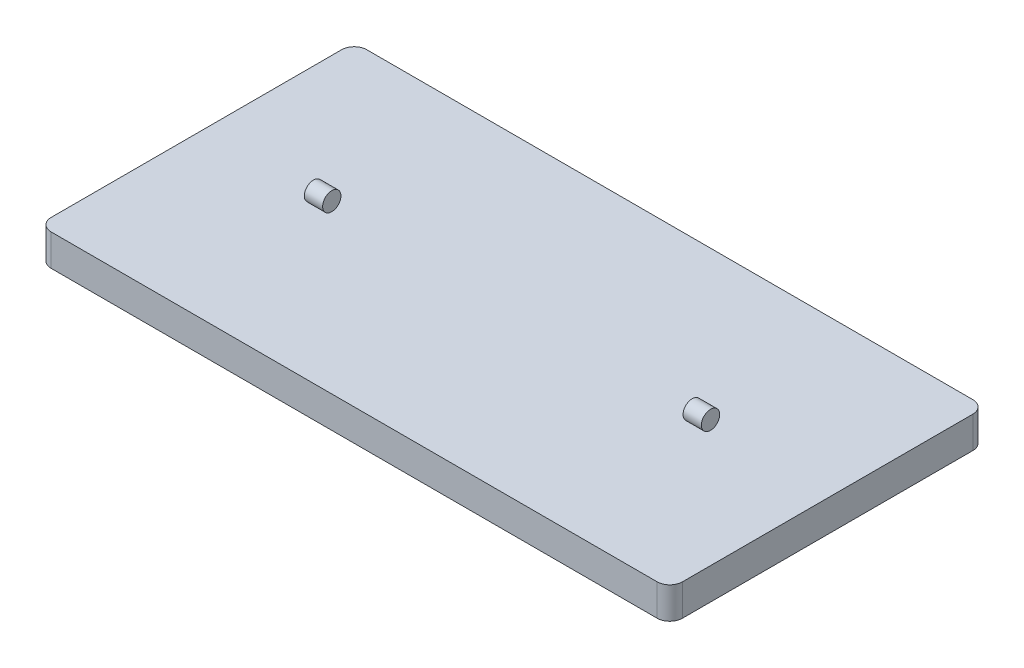
ISO-10303-21;
HEADER;
FILE_DESCRIPTION(('STEP AP214'),'2;1');
FILE_NAME('part.step','',(''),(''),'','','');
FILE_SCHEMA(('AUTOMOTIVE_DESIGN { 1 0 10303 214 1 1 1 1 }'));
ENDSEC;
DATA;
#1=APPLICATION_CONTEXT('core data for automotive mechanical design processes');
#2=APPLICATION_PROTOCOL_DEFINITION('international standard','automotive_design',2000,#1);
#3=PRODUCT_CONTEXT('',#1,'mechanical');
#4=PRODUCT('Part','Part','',(#3));
#5=PRODUCT_RELATED_PRODUCT_CATEGORY('part','',(#4));
#6=PRODUCT_DEFINITION_FORMATION('','',#4);
#7=PRODUCT_DEFINITION_CONTEXT('part definition',#1,'design');
#8=PRODUCT_DEFINITION('design','',#6,#7);
#9=PRODUCT_DEFINITION_SHAPE('','',#8);
#10=(LENGTH_UNIT() NAMED_UNIT(*) SI_UNIT(.MILLI.,.METRE.));
#11=(NAMED_UNIT(*) PLANE_ANGLE_UNIT() SI_UNIT($,.RADIAN.));
#12=(NAMED_UNIT(*) SI_UNIT($,.STERADIAN.) SOLID_ANGLE_UNIT());
#13=UNCERTAINTY_MEASURE_WITH_UNIT(LENGTH_MEASURE(1.E-05),#10,'distance_accuracy_value','');
#14=(GEOMETRIC_REPRESENTATION_CONTEXT(3) GLOBAL_UNCERTAINTY_ASSIGNED_CONTEXT((#13)) GLOBAL_UNIT_ASSIGNED_CONTEXT((#10,
#11,#12)) REPRESENTATION_CONTEXT('',''));
#15=CARTESIAN_POINT('',(0.,0.,0.));
#16=DIRECTION('',(0.,0.,1.));
#17=DIRECTION('',(1.,0.,0.));
#18=AXIS2_PLACEMENT_3D('',#15,#16,#17);
#19=CARTESIAN_POINT('',(-142.75,32.25,0.));
#20=DIRECTION('',(-1.,0.,0.));
#21=DIRECTION('',(0.,0.,-1.));
#22=AXIS2_PLACEMENT_3D('',#19,#20,#21);
#23=CYLINDRICAL_SURFACE('',#22,7.25);
#24=CARTESIAN_POINT('',(-142.75,32.25,0.));
#25=DIRECTION('',(1.,0.,0.));
#26=DIRECTION('',(0.,0.,-1.));
#27=AXIS2_PLACEMENT_3D('',#24,#25,#26);
#28=CIRCLE('',#27,7.25);
#29=CARTESIAN_POINT('',(-142.75,32.25,-7.25));
#30=VERTEX_POINT('',#29);
#31=EDGE_CURVE('E11',#30,#30,#28,.T.);
#32=CARTESIAN_POINT('',(-157.25,32.25,0.));
#33=DIRECTION('',(1.,0.,0.));
#34=DIRECTION('',(0.,0.,-1.));
#35=AXIS2_PLACEMENT_3D('',#32,#33,#34);
#36=CIRCLE('',#35,7.25);
#37=CARTESIAN_POINT('',(-157.25,32.25,-7.25));
#38=VERTEX_POINT('',#37);
#39=EDGE_CURVE('E56',#38,#38,#36,.T.);
#40=CARTESIAN_POINT('',(-142.75,32.25,-7.25));
#41=CARTESIAN_POINT('',(-142.901041666667,32.25,-7.25));
#42=CARTESIAN_POINT('',(-143.052083333333,32.25,-7.25));
#43=CARTESIAN_POINT('',(-143.354166666667,32.25,-7.25));
#44=CARTESIAN_POINT('',(-143.505208333333,32.25,-7.25));
#45=CARTESIAN_POINT('',(-143.807291666667,32.25,-7.25));
#46=CARTESIAN_POINT('',(-143.958333333333,32.25,-7.25));
#47=CARTESIAN_POINT('',(-144.260416666667,32.25,-7.25));
#48=CARTESIAN_POINT('',(-144.411458333333,32.25,-7.25));
#49=CARTESIAN_POINT('',(-144.713541666667,32.25,-7.25));
#50=CARTESIAN_POINT('',(-144.864583333333,32.25,-7.25));
#51=CARTESIAN_POINT('',(-145.166666666667,32.25,-7.25));
#52=CARTESIAN_POINT('',(-145.317708333333,32.25,-7.25));
#53=CARTESIAN_POINT('',(-145.619791666667,32.25,-7.25));
#54=CARTESIAN_POINT('',(-145.770833333333,32.25,-7.25));
#55=CARTESIAN_POINT('',(-146.072916666667,32.25,-7.25));
#56=CARTESIAN_POINT('',(-146.223958333333,32.25,-7.25));
#57=CARTESIAN_POINT('',(-146.526041666667,32.25,-7.25));
#58=CARTESIAN_POINT('',(-146.677083333333,32.25,-7.25));
#59=CARTESIAN_POINT('',(-146.979166666667,32.25,-7.25));
#60=CARTESIAN_POINT('',(-147.130208333333,32.25,-7.25));
#61=CARTESIAN_POINT('',(-147.432291666667,32.25,-7.25));
#62=CARTESIAN_POINT('',(-147.583333333333,32.25,-7.25));
#63=CARTESIAN_POINT('',(-147.885416666667,32.25,-7.25));
#64=CARTESIAN_POINT('',(-148.036458333333,32.25,-7.25));
#65=CARTESIAN_POINT('',(-148.338541666667,32.25,-7.25));
#66=CARTESIAN_POINT('',(-148.489583333333,32.25,-7.25));
#67=CARTESIAN_POINT('',(-148.791666666667,32.25,-7.25));
#68=CARTESIAN_POINT('',(-148.942708333333,32.25,-7.25));
#69=CARTESIAN_POINT('',(-149.244791666667,32.25,-7.25));
#70=CARTESIAN_POINT('',(-149.395833333333,32.25,-7.25));
#71=CARTESIAN_POINT('',(-149.697916666667,32.25,-7.25));
#72=CARTESIAN_POINT('',(-149.848958333333,32.25,-7.25));
#73=CARTESIAN_POINT('',(-150.151041666667,32.25,-7.25));
#74=CARTESIAN_POINT('',(-150.302083333333,32.25,-7.25));
#75=CARTESIAN_POINT('',(-150.604166666667,32.25,-7.25));
#76=CARTESIAN_POINT('',(-150.755208333333,32.25,-7.25));
#77=CARTESIAN_POINT('',(-151.057291666667,32.25,-7.25));
#78=CARTESIAN_POINT('',(-151.208333333333,32.25,-7.25));
#79=CARTESIAN_POINT('',(-151.510416666667,32.25,-7.25));
#80=CARTESIAN_POINT('',(-151.661458333333,32.25,-7.25));
#81=CARTESIAN_POINT('',(-151.963541666667,32.25,-7.25));
#82=CARTESIAN_POINT('',(-152.114583333333,32.25,-7.25));
#83=CARTESIAN_POINT('',(-152.416666666667,32.25,-7.25));
#84=CARTESIAN_POINT('',(-152.567708333333,32.25,-7.25));
#85=CARTESIAN_POINT('',(-152.869791666667,32.25,-7.25));
#86=CARTESIAN_POINT('',(-153.020833333333,32.25,-7.25));
#87=CARTESIAN_POINT('',(-153.322916666667,32.25,-7.25));
#88=CARTESIAN_POINT('',(-153.473958333333,32.25,-7.25));
#89=CARTESIAN_POINT('',(-153.776041666667,32.25,-7.25));
#90=CARTESIAN_POINT('',(-153.927083333333,32.25,-7.25));
#91=CARTESIAN_POINT('',(-154.229166666667,32.25,-7.25));
#92=CARTESIAN_POINT('',(-154.380208333333,32.25,-7.25));
#93=CARTESIAN_POINT('',(-154.682291666667,32.25,-7.25));
#94=CARTESIAN_POINT('',(-154.833333333333,32.25,-7.25));
#95=CARTESIAN_POINT('',(-155.135416666667,32.25,-7.25));
#96=CARTESIAN_POINT('',(-155.286458333333,32.25,-7.25));
#97=CARTESIAN_POINT('',(-155.588541666667,32.25,-7.25));
#98=CARTESIAN_POINT('',(-155.739583333333,32.25,-7.25));
#99=CARTESIAN_POINT('',(-156.041666666667,32.25,-7.25));
#100=CARTESIAN_POINT('',(-156.192708333333,32.25,-7.25));
#101=CARTESIAN_POINT('',(-156.494791666667,32.25,-7.25));
#102=CARTESIAN_POINT('',(-156.645833333333,32.25,-7.25));
#103=CARTESIAN_POINT('',(-156.947916666667,32.25,-7.25));
#104=CARTESIAN_POINT('',(-157.098958333333,32.25,-7.25));
#105=CARTESIAN_POINT('',(-157.25,32.25,-7.25));
#106=B_SPLINE_CURVE_WITH_KNOTS('',3,(#40,#41,#42,#43,#44,#45,#46,#47,#48,#49,#50,#51,#52,#53,
#54,#55,#56,#57,#58,#59,#60,#61,#62,#63,#64,#65,#66,#67,#68,#69,#70,#71,#72,#73,#74,#75,#76,#77,
#78,#79,#80,#81,#82,#83,#84,#85,#86,#87,#88,#89,#90,#91,#92,#93,#94,#95,#96,#97,#98,#99,#100,
#101,#102,#103,#104,#105),.UNSPECIFIED.,.F.,.F.,(4,2,2,2,2,2,2,2,2,2,2,2,2,2,2,2,2,2,2,2,2,2,2,
2,2,2,2,2,2,2,2,2,4),(0.,0.453124999999999,0.906249999999997,1.359375,1.81249999999999,
2.26562499999999,2.71874999999999,3.17187499999999,3.62499999999999,4.07812499999999,
4.53124999999999,4.98437499999999,5.43749999999998,5.89062499999998,6.34374999999998,
6.79687499999998,7.25000000000001,7.70312500000001,8.15625,8.609375,9.0625,9.515625,9.96875,
10.421875,10.875,11.328125,11.78125,12.234375,12.6875,13.140625,13.59375,14.046875,14.5),.UNSPECIFIED.);
#107=EDGE_CURVE('BSEAM50',#30,#38,#106,.T.);
#108=ORIENTED_EDGE('',*,*,#31,.F.);
#109=ORIENTED_EDGE('',*,*,#39,.T.);
#110=ORIENTED_EDGE('',*,*,#107,.T.);
#111=ORIENTED_EDGE('',*,*,#107,.F.);
#112=EDGE_LOOP('',(#108,#110,#109,#111));
#113=FACE_BOUND('',#112,.T.);
#114=ADVANCED_FACE('F50',(#113),#23,.T.);
#115=CARTESIAN_POINT('',(-142.75,32.25,0.));
#116=DIRECTION('',(-1.,0.,0.));
#117=DIRECTION('',(0.,0.,-1.));
#118=AXIS2_PLACEMENT_3D('',#115,#116,#117);
#119=PLANE('',#118);
#120=ORIENTED_EDGE('',*,*,#31,.T.);
#121=EDGE_LOOP('',(#120));
#122=FACE_BOUND('',#121,.T.);
#123=ADVANCED_FACE('F65',(#122),#119,.F.);
#124=CARTESIAN_POINT('',(-157.25,32.25,0.));
#125=DIRECTION('',(-1.,0.,0.));
#126=DIRECTION('',(0.,0.,-1.));
#127=AXIS2_PLACEMENT_3D('',#124,#125,#126);
#128=PLANE('',#127);
#129=ORIENTED_EDGE('',*,*,#39,.F.);
#130=EDGE_LOOP('',(#129));
#131=FACE_BOUND('',#130,.T.);
#132=ADVANCED_FACE('F63',(#131),#128,.T.);
#133=CLOSED_SHELL('',(#114,#123,#132));
#134=MANIFOLD_SOLID_BREP('B2',#133);
#135=CARTESIAN_POINT('',(142.75,32.25,0.));
#136=DIRECTION('',(1.,0.,0.));
#137=DIRECTION('',(0.,0.,-1.));
#138=AXIS2_PLACEMENT_3D('',#135,#136,#137);
#139=CYLINDRICAL_SURFACE('',#138,7.25);
#140=CARTESIAN_POINT('',(142.75,32.25,0.));
#141=DIRECTION('',(1.,0.,0.));
#142=DIRECTION('',(0.,0.,-1.));
#143=AXIS2_PLACEMENT_3D('',#140,#141,#142);
#144=CIRCLE('',#143,7.25);
#145=CARTESIAN_POINT('',(142.75,32.25,-7.25));
#146=VERTEX_POINT('',#145);
#147=EDGE_CURVE('E49',#146,#146,#144,.T.);
#148=CARTESIAN_POINT('',(157.25,32.25,0.));
#149=DIRECTION('',(1.,0.,0.));
#150=DIRECTION('',(0.,0.,-1.));
#151=AXIS2_PLACEMENT_3D('',#148,#149,#150);
#152=CIRCLE('',#151,7.25);
#153=CARTESIAN_POINT('',(157.25,32.25,-7.25));
#154=VERTEX_POINT('',#153);
#155=EDGE_CURVE('E112',#154,#154,#152,.T.);
#156=CARTESIAN_POINT('',(142.75,32.25,-7.25));
#157=CARTESIAN_POINT('',(142.901041666667,32.25,-7.25));
#158=CARTESIAN_POINT('',(143.052083333333,32.25,-7.25));
#159=CARTESIAN_POINT('',(143.354166666667,32.25,-7.25));
#160=CARTESIAN_POINT('',(143.505208333333,32.25,-7.25));
#161=CARTESIAN_POINT('',(143.807291666667,32.25,-7.25));
#162=CARTESIAN_POINT('',(143.958333333333,32.25,-7.25));
#163=CARTESIAN_POINT('',(144.260416666667,32.25,-7.25));
#164=CARTESIAN_POINT('',(144.411458333333,32.25,-7.25));
#165=CARTESIAN_POINT('',(144.713541666667,32.25,-7.25));
#166=CARTESIAN_POINT('',(144.864583333333,32.25,-7.25));
#167=CARTESIAN_POINT('',(145.166666666667,32.25,-7.25));
#168=CARTESIAN_POINT('',(145.317708333333,32.25,-7.25));
#169=CARTESIAN_POINT('',(145.619791666667,32.25,-7.25));
#170=CARTESIAN_POINT('',(145.770833333333,32.25,-7.25));
#171=CARTESIAN_POINT('',(146.072916666667,32.25,-7.25));
#172=CARTESIAN_POINT('',(146.223958333333,32.25,-7.25));
#173=CARTESIAN_POINT('',(146.526041666667,32.25,-7.25));
#174=CARTESIAN_POINT('',(146.677083333333,32.25,-7.25));
#175=CARTESIAN_POINT('',(146.979166666667,32.25,-7.25));
#176=CARTESIAN_POINT('',(147.130208333333,32.25,-7.25));
#177=CARTESIAN_POINT('',(147.432291666667,32.25,-7.25));
#178=CARTESIAN_POINT('',(147.583333333333,32.25,-7.25));
#179=CARTESIAN_POINT('',(147.885416666667,32.25,-7.25));
#180=CARTESIAN_POINT('',(148.036458333333,32.25,-7.25));
#181=CARTESIAN_POINT('',(148.338541666667,32.25,-7.25));
#182=CARTESIAN_POINT('',(148.489583333333,32.25,-7.25));
#183=CARTESIAN_POINT('',(148.791666666667,32.25,-7.25));
#184=CARTESIAN_POINT('',(148.942708333333,32.25,-7.25));
#185=CARTESIAN_POINT('',(149.244791666667,32.25,-7.25));
#186=CARTESIAN_POINT('',(149.395833333333,32.25,-7.25));
#187=CARTESIAN_POINT('',(149.697916666667,32.25,-7.25));
#188=CARTESIAN_POINT('',(149.848958333333,32.25,-7.25));
#189=CARTESIAN_POINT('',(150.151041666667,32.25,-7.25));
#190=CARTESIAN_POINT('',(150.302083333333,32.25,-7.25));
#191=CARTESIAN_POINT('',(150.604166666667,32.25,-7.25));
#192=CARTESIAN_POINT('',(150.755208333333,32.25,-7.25));
#193=CARTESIAN_POINT('',(151.057291666667,32.25,-7.25));
#194=CARTESIAN_POINT('',(151.208333333333,32.25,-7.25));
#195=CARTESIAN_POINT('',(151.510416666667,32.25,-7.25));
#196=CARTESIAN_POINT('',(151.661458333333,32.25,-7.25));
#197=CARTESIAN_POINT('',(151.963541666667,32.25,-7.25));
#198=CARTESIAN_POINT('',(152.114583333333,32.25,-7.25));
#199=CARTESIAN_POINT('',(152.416666666667,32.25,-7.25));
#200=CARTESIAN_POINT('',(152.567708333333,32.25,-7.25));
#201=CARTESIAN_POINT('',(152.869791666667,32.25,-7.25));
#202=CARTESIAN_POINT('',(153.020833333333,32.25,-7.25));
#203=CARTESIAN_POINT('',(153.322916666667,32.25,-7.25));
#204=CARTESIAN_POINT('',(153.473958333333,32.25,-7.25));
#205=CARTESIAN_POINT('',(153.776041666667,32.25,-7.25));
#206=CARTESIAN_POINT('',(153.927083333333,32.25,-7.25));
#207=CARTESIAN_POINT('',(154.229166666667,32.25,-7.25));
#208=CARTESIAN_POINT('',(154.380208333333,32.25,-7.25));
#209=CARTESIAN_POINT('',(154.682291666667,32.25,-7.25));
#210=CARTESIAN_POINT('',(154.833333333333,32.25,-7.25));
#211=CARTESIAN_POINT('',(155.135416666667,32.25,-7.25));
#212=CARTESIAN_POINT('',(155.286458333333,32.25,-7.25));
#213=CARTESIAN_POINT('',(155.588541666667,32.25,-7.25));
#214=CARTESIAN_POINT('',(155.739583333333,32.25,-7.25));
#215=CARTESIAN_POINT('',(156.041666666667,32.25,-7.25));
#216=CARTESIAN_POINT('',(156.192708333333,32.25,-7.25));
#217=CARTESIAN_POINT('',(156.494791666667,32.25,-7.25));
#218=CARTESIAN_POINT('',(156.645833333333,32.25,-7.25));
#219=CARTESIAN_POINT('',(156.947916666667,32.25,-7.25));
#220=CARTESIAN_POINT('',(157.098958333333,32.25,-7.25));
#221=CARTESIAN_POINT('',(157.25,32.25,-7.25));
#222=B_SPLINE_CURVE_WITH_KNOTS('',3,(#156,#157,#158,#159,#160,#161,#162,#163,#164,#165,#166,
#167,#168,#169,#170,#171,#172,#173,#174,#175,#176,#177,#178,#179,#180,#181,#182,#183,#184,#185,
#186,#187,#188,#189,#190,#191,#192,#193,#194,#195,#196,#197,#198,#199,#200,#201,#202,#203,#204,
#205,#206,#207,#208,#209,#210,#211,#212,#213,#214,#215,#216,#217,#218,#219,#220,#221),
.UNSPECIFIED.,.F.,.F.,(4,2,2,2,2,2,2,2,2,2,2,2,2,2,2,2,2,2,2,2,2,2,2,2,2,2,2,2,2,2,2,2,4),(0.,
0.453125000000026,0.906250000000025,1.35937500000002,1.81250000000002,2.26562500000002,
2.71875000000002,3.17187500000002,3.62500000000002,4.07812500000002,4.53125000000001,
4.98437500000001,5.43750000000001,5.89062500000001,6.34375000000001,6.79687500000001,
7.25000000000001,7.70312500000003,8.15625000000003,8.60937500000003,9.06250000000003,
9.51562500000003,9.96875000000003,10.421875,10.875,11.328125,11.78125,12.234375,12.6875,
13.140625,13.59375,14.046875,14.5),.UNSPECIFIED.);
#223=EDGE_CURVE('BSEAM106',#146,#154,#222,.T.);
#224=ORIENTED_EDGE('',*,*,#147,.T.);
#225=ORIENTED_EDGE('',*,*,#155,.F.);
#226=ORIENTED_EDGE('',*,*,#223,.T.);
#227=ORIENTED_EDGE('',*,*,#223,.F.);
#228=EDGE_LOOP('',(#224,#226,#225,#227));
#229=FACE_BOUND('',#228,.T.);
#230=ADVANCED_FACE('F106',(#229),#139,.T.);
#231=CARTESIAN_POINT('',(142.75,32.25,0.));
#232=DIRECTION('',(1.,0.,0.));
#233=DIRECTION('',(0.,0.,-1.));
#234=AXIS2_PLACEMENT_3D('',#231,#232,#233);
#235=PLANE('',#234);
#236=ORIENTED_EDGE('',*,*,#147,.F.);
#237=EDGE_LOOP('',(#236));
#238=FACE_BOUND('',#237,.T.);
#239=ADVANCED_FACE('F121',(#238),#235,.F.);
#240=CARTESIAN_POINT('',(157.25,32.25,0.));
#241=DIRECTION('',(1.,0.,0.));
#242=DIRECTION('',(0.,0.,-1.));
#243=AXIS2_PLACEMENT_3D('',#240,#241,#242);
#244=PLANE('',#243);
#245=ORIENTED_EDGE('',*,*,#155,.T.);
#246=EDGE_LOOP('',(#245));
#247=FACE_BOUND('',#246,.T.);
#248=ADVANCED_FACE('F118',(#247),#244,.T.);
#249=CLOSED_SHELL('',(#230,#239,#248));
#250=MANIFOLD_SOLID_BREP('B6',#249);
#251=CARTESIAN_POINT('',(-250.,25.,125.));
#252=DIRECTION('',(1.,0.,0.));
#253=DIRECTION('',(0.,0.,-1.));
#254=AXIS2_PLACEMENT_3D('',#251,#252,#253);
#255=PLANE('',#254);
#256=DIRECTION('',(0.,0.,1.));
#257=VECTOR('',#256,1.);
#258=CARTESIAN_POINT('',(-250.,25.,125.));
#259=LINE('',#258,#257);
#260=CARTESIAN_POINT('',(-250.,25.,-115.));
#261=VERTEX_POINT('',#260);
#262=CARTESIAN_POINT('',(-250.,25.,115.));
#263=VERTEX_POINT('',#262);
#264=EDGE_CURVE('E240',#261,#263,#259,.T.);
#265=ORIENTED_EDGE('',*,*,#264,.F.);
#266=DIRECTION('',(0.,-1.,0.));
#267=VECTOR('',#266,1.);
#268=CARTESIAN_POINT('',(-250.,25.,-115.));
#269=LINE('',#268,#267);
#270=CARTESIAN_POINT('',(-250.,0.,-115.));
#271=VERTEX_POINT('',#270);
#272=EDGE_CURVE('E224',#261,#271,#269,.T.);
#273=ORIENTED_EDGE('',*,*,#272,.T.);
#274=DIRECTION('',(0.,0.,1.));
#275=VECTOR('',#274,1.);
#276=CARTESIAN_POINT('',(-250.,0.,125.));
#277=LINE('',#276,#275);
#278=CARTESIAN_POINT('',(-250.,0.,115.));
#279=VERTEX_POINT('',#278);
#280=EDGE_CURVE('E237',#271,#279,#277,.T.);
#281=ORIENTED_EDGE('',*,*,#280,.T.);
#282=DIRECTION('',(0.,-1.,0.));
#283=VECTOR('',#282,1.);
#284=CARTESIAN_POINT('',(-250.,25.,115.));
#285=LINE('',#284,#283);
#286=EDGE_CURVE('E243',#279,#263,#285,.F.);
#287=ORIENTED_EDGE('',*,*,#286,.T.);
#288=EDGE_LOOP('',(#265,#273,#281,#287));
#289=FACE_BOUND('',#288,.T.);
#290=ADVANCED_FACE('F153',(#289),#255,.F.);
#291=CARTESIAN_POINT('',(250.,25.,125.));
#292=DIRECTION('',(0.,0.,-1.));
#293=DIRECTION('',(-1.,0.,0.));
#294=AXIS2_PLACEMENT_3D('',#291,#292,#293);
#295=PLANE('',#294);
#296=DIRECTION('',(1.,0.,0.));
#297=VECTOR('',#296,1.);
#298=CARTESIAN_POINT('',(250.,0.,125.));
#299=LINE('',#298,#297);
#300=CARTESIAN_POINT('',(-240.,0.,125.));
#301=VERTEX_POINT('',#300);
#302=CARTESIAN_POINT('',(240.,0.,125.));
#303=VERTEX_POINT('',#302);
#304=EDGE_CURVE('E248',#301,#303,#299,.T.);
#305=ORIENTED_EDGE('',*,*,#304,.T.);
#306=DIRECTION('',(0.,-1.,0.));
#307=VECTOR('',#306,1.);
#308=CARTESIAN_POINT('',(240.,25.,125.));
#309=LINE('',#308,#307);
#310=CARTESIAN_POINT('',(240.,25.,125.));
#311=VERTEX_POINT('',#310);
#312=EDGE_CURVE('E104',#303,#311,#309,.F.);
#313=ORIENTED_EDGE('',*,*,#312,.T.);
#314=DIRECTION('',(1.,0.,0.));
#315=VECTOR('',#314,1.);
#316=CARTESIAN_POINT('',(250.,25.,125.));
#317=LINE('',#316,#315);
#318=CARTESIAN_POINT('',(-240.,25.,125.));
#319=VERTEX_POINT('',#318);
#320=EDGE_CURVE('E300',#319,#311,#317,.T.);
#321=ORIENTED_EDGE('',*,*,#320,.F.);
#322=DIRECTION('',(0.,-1.,0.));
#323=VECTOR('',#322,1.);
#324=CARTESIAN_POINT('',(-240.,25.,125.));
#325=LINE('',#324,#323);
#326=EDGE_CURVE('E162',#319,#301,#325,.T.);
#327=ORIENTED_EDGE('',*,*,#326,.T.);
#328=EDGE_LOOP('',(#305,#313,#321,#327));
#329=FACE_BOUND('',#328,.T.);
#330=ADVANCED_FACE('F298',(#329),#295,.F.);
#331=CARTESIAN_POINT('',(250.,25.,125.));
#332=DIRECTION('',(-1.,0.,0.));
#333=DIRECTION('',(0.,0.,1.));
#334=AXIS2_PLACEMENT_3D('',#331,#332,#333);
#335=PLANE('',#334);
#336=DIRECTION('',(0.,0.,-1.));
#337=VECTOR('',#336,1.);
#338=CARTESIAN_POINT('',(250.,0.,125.));
#339=LINE('',#338,#337);
#340=CARTESIAN_POINT('',(250.,0.,115.));
#341=VERTEX_POINT('',#340);
#342=CARTESIAN_POINT('',(250.,0.,-115.));
#343=VERTEX_POINT('',#342);
#344=EDGE_CURVE('E252',#341,#343,#339,.T.);
#345=ORIENTED_EDGE('',*,*,#344,.T.);
#346=DIRECTION('',(0.,-1.,0.));
#347=VECTOR('',#346,1.);
#348=CARTESIAN_POINT('',(250.,25.,-115.));
#349=LINE('',#348,#347);
#350=CARTESIAN_POINT('',(250.,25.,-115.));
#351=VERTEX_POINT('',#350);
#352=EDGE_CURVE('E169',#343,#351,#349,.F.);
#353=ORIENTED_EDGE('',*,*,#352,.T.);
#354=DIRECTION('',(0.,0.,-1.));
#355=VECTOR('',#354,1.);
#356=CARTESIAN_POINT('',(250.,25.,125.));
#357=LINE('',#356,#355);
#358=CARTESIAN_POINT('',(250.,25.,115.));
#359=VERTEX_POINT('',#358);
#360=EDGE_CURVE('E308',#359,#351,#357,.T.);
#361=ORIENTED_EDGE('',*,*,#360,.F.);
#362=DIRECTION('',(0.,-1.,0.));
#363=VECTOR('',#362,1.);
#364=CARTESIAN_POINT('',(250.,25.,115.));
#365=LINE('',#364,#363);
#366=EDGE_CURVE('E288',#359,#341,#365,.T.);
#367=ORIENTED_EDGE('',*,*,#366,.T.);
#368=EDGE_LOOP('',(#345,#353,#361,#367));
#369=FACE_BOUND('',#368,.T.);
#370=ADVANCED_FACE('F307',(#369),#335,.F.);
#371=CARTESIAN_POINT('',(250.,25.,-125.));
#372=DIRECTION('',(0.,0.,1.));
#373=DIRECTION('',(1.,0.,0.));
#374=AXIS2_PLACEMENT_3D('',#371,#372,#373);
#375=PLANE('',#374);
#376=DIRECTION('',(-1.,0.,0.));
#377=VECTOR('',#376,1.);
#378=CARTESIAN_POINT('',(250.,0.,-125.));
#379=LINE('',#378,#377);
#380=CARTESIAN_POINT('',(240.,0.,-125.));
#381=VERTEX_POINT('',#380);
#382=CARTESIAN_POINT('',(-240.,0.,-125.));
#383=VERTEX_POINT('',#382);
#384=EDGE_CURVE('E260',#381,#383,#379,.T.);
#385=ORIENTED_EDGE('',*,*,#384,.T.);
#386=DIRECTION('',(0.,-1.,0.));
#387=VECTOR('',#386,1.);
#388=CARTESIAN_POINT('',(-240.,25.,-125.));
#389=LINE('',#388,#387);
#390=CARTESIAN_POINT('',(-240.,25.,-125.));
#391=VERTEX_POINT('',#390);
#392=EDGE_CURVE('E225',#383,#391,#389,.F.);
#393=ORIENTED_EDGE('',*,*,#392,.T.);
#394=DIRECTION('',(-1.,0.,0.));
#395=VECTOR('',#394,1.);
#396=CARTESIAN_POINT('',(250.,25.,-125.));
#397=LINE('',#396,#395);
#398=CARTESIAN_POINT('',(240.,25.,-125.));
#399=VERTEX_POINT('',#398);
#400=EDGE_CURVE('E255',#399,#391,#397,.T.);
#401=ORIENTED_EDGE('',*,*,#400,.F.);
#402=DIRECTION('',(0.,-1.,0.));
#403=VECTOR('',#402,1.);
#404=CARTESIAN_POINT('',(240.,25.,-125.));
#405=LINE('',#404,#403);
#406=EDGE_CURVE('E231',#399,#381,#405,.T.);
#407=ORIENTED_EDGE('',*,*,#406,.T.);
#408=EDGE_LOOP('',(#385,#393,#401,#407));
#409=FACE_BOUND('',#408,.T.);
#410=ADVANCED_FACE('F340',(#409),#375,.F.);
#411=CARTESIAN_POINT('',(0.,25.,0.));
#412=DIRECTION('',(0.,1.,0.));
#413=DIRECTION('',(0.,0.,1.));
#414=AXIS2_PLACEMENT_3D('',#411,#412,#413);
#415=PLANE('',#414);
#416=ORIENTED_EDGE('',*,*,#400,.T.);
#417=CARTESIAN_POINT('',(-240.,25.,-115.));
#418=DIRECTION('',(0.,1.,0.));
#419=DIRECTION('',(0.,0.,1.));
#420=AXIS2_PLACEMENT_3D('',#417,#418,#419);
#421=CIRCLE('',#420,10.);
#422=EDGE_CURVE('E285',#391,#261,#421,.T.);
#423=ORIENTED_EDGE('',*,*,#422,.T.);
#424=ORIENTED_EDGE('',*,*,#264,.T.);
#425=CARTESIAN_POINT('',(-240.,25.,115.));
#426=DIRECTION('',(0.,1.,0.));
#427=DIRECTION('',(0.,0.,1.));
#428=AXIS2_PLACEMENT_3D('',#425,#426,#427);
#429=CIRCLE('',#428,10.);
#430=EDGE_CURVE('E277',#263,#319,#429,.T.);
#431=ORIENTED_EDGE('',*,*,#430,.T.);
#432=ORIENTED_EDGE('',*,*,#320,.T.);
#433=CARTESIAN_POINT('',(240.,25.,115.));
#434=DIRECTION('',(0.,1.,0.));
#435=DIRECTION('',(0.,0.,1.));
#436=AXIS2_PLACEMENT_3D('',#433,#434,#435);
#437=CIRCLE('',#436,10.);
#438=EDGE_CURVE('E176',#311,#359,#437,.T.);
#439=ORIENTED_EDGE('',*,*,#438,.T.);
#440=ORIENTED_EDGE('',*,*,#360,.T.);
#441=CARTESIAN_POINT('',(240.,25.,-115.));
#442=DIRECTION('',(0.,1.,0.));
#443=DIRECTION('',(0.,0.,1.));
#444=AXIS2_PLACEMENT_3D('',#441,#442,#443);
#445=CIRCLE('',#444,10.);
#446=EDGE_CURVE('E282',#351,#399,#445,.T.);
#447=ORIENTED_EDGE('',*,*,#446,.T.);
#448=EDGE_LOOP('',(#416,#423,#424,#431,#432,#439,#440,#447));
#449=FACE_BOUND('',#448,.T.);
#450=ADVANCED_FACE('F317',(#449),#415,.T.);
#451=CARTESIAN_POINT('',(0.,0.,0.));
#452=DIRECTION('',(0.,1.,0.));
#453=DIRECTION('',(0.,0.,1.));
#454=AXIS2_PLACEMENT_3D('',#451,#452,#453);
#455=PLANE('',#454);
#456=ORIENTED_EDGE('',*,*,#280,.F.);
#457=CARTESIAN_POINT('',(-240.,0.,-115.));
#458=DIRECTION('',(0.,1.,0.));
#459=DIRECTION('',(0.,0.,1.));
#460=AXIS2_PLACEMENT_3D('',#457,#458,#459);
#461=CIRCLE('',#460,10.);
#462=EDGE_CURVE('E220',#271,#383,#461,.F.);
#463=ORIENTED_EDGE('',*,*,#462,.T.);
#464=ORIENTED_EDGE('',*,*,#384,.F.);
#465=CARTESIAN_POINT('',(240.,0.,-115.));
#466=DIRECTION('',(0.,1.,0.));
#467=DIRECTION('',(0.,0.,1.));
#468=AXIS2_PLACEMENT_3D('',#465,#466,#467);
#469=CIRCLE('',#468,10.);
#470=EDGE_CURVE('E232',#381,#343,#469,.F.);
#471=ORIENTED_EDGE('',*,*,#470,.T.);
#472=ORIENTED_EDGE('',*,*,#344,.F.);
#473=CARTESIAN_POINT('',(240.,0.,115.));
#474=DIRECTION('',(0.,1.,0.));
#475=DIRECTION('',(0.,0.,1.));
#476=AXIS2_PLACEMENT_3D('',#473,#474,#475);
#477=CIRCLE('',#476,10.);
#478=EDGE_CURVE('E267',#341,#303,#477,.F.);
#479=ORIENTED_EDGE('',*,*,#478,.T.);
#480=ORIENTED_EDGE('',*,*,#304,.F.);
#481=CARTESIAN_POINT('',(-240.,0.,115.));
#482=DIRECTION('',(0.,1.,0.));
#483=DIRECTION('',(0.,0.,1.));
#484=AXIS2_PLACEMENT_3D('',#481,#482,#483);
#485=CIRCLE('',#484,10.);
#486=EDGE_CURVE('E242',#301,#279,#485,.F.);
#487=ORIENTED_EDGE('',*,*,#486,.T.);
#488=EDGE_LOOP('',(#456,#463,#464,#471,#472,#479,#480,#487));
#489=FACE_BOUND('',#488,.T.);
#490=ADVANCED_FACE('F245',(#489),#455,.F.);
#491=CARTESIAN_POINT('',(-240.,25.,-115.));
#492=DIRECTION('',(0.,-1.,0.));
#493=DIRECTION('',(0.,0.,-1.));
#494=AXIS2_PLACEMENT_3D('',#491,#492,#493);
#495=CYLINDRICAL_SURFACE('',#494,10.);
#496=ORIENTED_EDGE('',*,*,#422,.F.);
#497=ORIENTED_EDGE('',*,*,#392,.F.);
#498=ORIENTED_EDGE('',*,*,#462,.F.);
#499=ORIENTED_EDGE('',*,*,#272,.F.);
#500=EDGE_LOOP('',(#496,#497,#498,#499));
#501=FACE_BOUND('',#500,.T.);
#502=ADVANCED_FACE('F223',(#501),#495,.T.);
#503=CARTESIAN_POINT('',(240.,25.,-115.));
#504=DIRECTION('',(0.,-1.,0.));
#505=DIRECTION('',(0.,0.,-1.));
#506=AXIS2_PLACEMENT_3D('',#503,#504,#505);
#507=CYLINDRICAL_SURFACE('',#506,10.);
#508=ORIENTED_EDGE('',*,*,#446,.F.);
#509=ORIENTED_EDGE('',*,*,#352,.F.);
#510=ORIENTED_EDGE('',*,*,#470,.F.);
#511=ORIENTED_EDGE('',*,*,#406,.F.);
#512=EDGE_LOOP('',(#508,#509,#510,#511));
#513=FACE_BOUND('',#512,.T.);
#514=ADVANCED_FACE('F322',(#513),#507,.T.);
#515=CARTESIAN_POINT('',(240.,25.,115.));
#516=DIRECTION('',(0.,-1.,0.));
#517=DIRECTION('',(0.,0.,-1.));
#518=AXIS2_PLACEMENT_3D('',#515,#516,#517);
#519=CYLINDRICAL_SURFACE('',#518,10.);
#520=ORIENTED_EDGE('',*,*,#438,.F.);
#521=ORIENTED_EDGE('',*,*,#312,.F.);
#522=ORIENTED_EDGE('',*,*,#478,.F.);
#523=ORIENTED_EDGE('',*,*,#366,.F.);
#524=EDGE_LOOP('',(#520,#521,#522,#523));
#525=FACE_BOUND('',#524,.T.);
#526=ADVANCED_FACE('F306',(#525),#519,.T.);
#527=CARTESIAN_POINT('',(-240.,25.,115.));
#528=DIRECTION('',(0.,-1.,0.));
#529=DIRECTION('',(0.,0.,-1.));
#530=AXIS2_PLACEMENT_3D('',#527,#528,#529);
#531=CYLINDRICAL_SURFACE('',#530,10.);
#532=ORIENTED_EDGE('',*,*,#430,.F.);
#533=ORIENTED_EDGE('',*,*,#286,.F.);
#534=ORIENTED_EDGE('',*,*,#486,.F.);
#535=ORIENTED_EDGE('',*,*,#326,.F.);
#536=EDGE_LOOP('',(#532,#533,#534,#535));
#537=FACE_BOUND('',#536,.T.);
#538=ADVANCED_FACE('F155',(#537),#531,.T.);
#539=CLOSED_SHELL('',(#290,#330,#370,#410,#450,#490,#502,#514,#526,#538));
#540=MANIFOLD_SOLID_BREP('B44',#539);
#541=ADVANCED_BREP_SHAPE_REPRESENTATION('',(#18,#134,#250,#540),#14);
#542=SHAPE_DEFINITION_REPRESENTATION(#9,#541);
ENDSEC;
END-ISO-10303-21;
